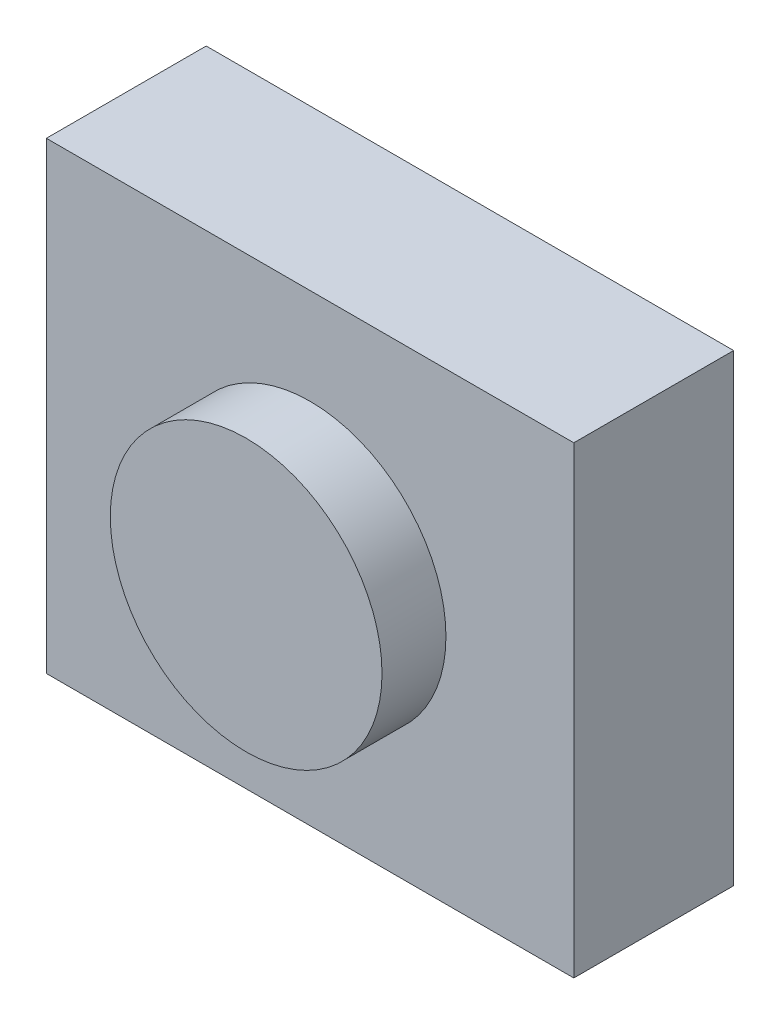
ISO-10303-21;
HEADER;
FILE_DESCRIPTION(('STEP AP214'),'2;1');
FILE_NAME('part.step','',(''),(''),'','','');
FILE_SCHEMA(('AUTOMOTIVE_DESIGN { 1 0 10303 214 1 1 1 1 }'));
ENDSEC;
DATA;
#1=APPLICATION_CONTEXT('core data for automotive mechanical design processes');
#2=APPLICATION_PROTOCOL_DEFINITION('international standard','automotive_design',2000,#1);
#3=PRODUCT_CONTEXT('',#1,'mechanical');
#4=PRODUCT('Part','Part','',(#3));
#5=PRODUCT_RELATED_PRODUCT_CATEGORY('part','',(#4));
#6=PRODUCT_DEFINITION_FORMATION('','',#4);
#7=PRODUCT_DEFINITION_CONTEXT('part definition',#1,'design');
#8=PRODUCT_DEFINITION('design','',#6,#7);
#9=PRODUCT_DEFINITION_SHAPE('','',#8);
#10=(LENGTH_UNIT() NAMED_UNIT(*) SI_UNIT(.MILLI.,.METRE.));
#11=(NAMED_UNIT(*) PLANE_ANGLE_UNIT() SI_UNIT($,.RADIAN.));
#12=(NAMED_UNIT(*) SI_UNIT($,.STERADIAN.) SOLID_ANGLE_UNIT());
#13=UNCERTAINTY_MEASURE_WITH_UNIT(LENGTH_MEASURE(1.E-05),#10,'distance_accuracy_value','');
#14=(GEOMETRIC_REPRESENTATION_CONTEXT(3) GLOBAL_UNCERTAINTY_ASSIGNED_CONTEXT((#13)) GLOBAL_UNIT_ASSIGNED_CONTEXT((#10,
#11,#12)) REPRESENTATION_CONTEXT('',''));
#15=CARTESIAN_POINT('',(0.,0.,0.));
#16=DIRECTION('',(0.,0.,1.));
#17=DIRECTION('',(1.,0.,0.));
#18=AXIS2_PLACEMENT_3D('',#15,#16,#17);
#19=CARTESIAN_POINT('',(0.,0.,1.4));
#20=DIRECTION('',(0.,0.,1.));
#21=DIRECTION('',(1.,0.,0.));
#22=AXIS2_PLACEMENT_3D('',#19,#20,#21);
#23=PLANE('',#22);
#24=CARTESIAN_POINT('',(0.,0.,1.4));
#25=DIRECTION('',(0.,0.,1.));
#26=DIRECTION('',(1.,0.,0.));
#27=AXIS2_PLACEMENT_3D('',#24,#25,#26);
#28=CIRCLE('',#27,0.85);
#29=CARTESIAN_POINT('',(0.85,0.,1.4));
#30=VERTEX_POINT('',#29);
#31=EDGE_CURVE('E20',#30,#30,#28,.F.);
#32=ORIENTED_EDGE('',*,*,#31,.F.);
#33=EDGE_LOOP('',(#32));
#34=FACE_BOUND('',#33,.T.);
#35=ADVANCED_FACE('F17',(#34),#23,.T.);
#36=CARTESIAN_POINT('',(0.,0.,1.));
#37=DIRECTION('',(0.,0.,1.));
#38=DIRECTION('',(1.,0.,0.));
#39=AXIS2_PLACEMENT_3D('',#36,#37,#38);
#40=CYLINDRICAL_SURFACE('',#39,0.85);
#41=CARTESIAN_POINT('',(0.,0.,1.));
#42=DIRECTION('',(0.,0.,1.));
#43=DIRECTION('',(1.,0.,0.));
#44=AXIS2_PLACEMENT_3D('',#41,#42,#43);
#45=CIRCLE('',#44,0.85);
#46=CARTESIAN_POINT('',(0.85,0.,1.));
#47=VERTEX_POINT('',#46);
#48=EDGE_CURVE('E75',#47,#47,#45,.F.);
#49=ORIENTED_EDGE('',*,*,#48,.F.);
#50=EDGE_LOOP('',(#49));
#51=FACE_BOUND('',#50,.T.);
#52=ORIENTED_EDGE('',*,*,#31,.T.);
#53=EDGE_LOOP('',(#52));
#54=FACE_BOUND('',#53,.T.);
#55=ADVANCED_FACE('F89',(#51,#54),#40,.T.);
#56=CARTESIAN_POINT('',(0.,0.,1.));
#57=DIRECTION('',(0.,0.,1.));
#58=DIRECTION('',(1.,0.,0.));
#59=AXIS2_PLACEMENT_3D('',#56,#57,#58);
#60=PLANE('',#59);
#61=ORIENTED_EDGE('',*,*,#48,.T.);
#62=EDGE_LOOP('',(#61));
#63=FACE_BOUND('',#62,.T.);
#64=DIRECTION('',(0.,1.,0.));
#65=VECTOR('',#64,1.);
#66=CARTESIAN_POINT('',(-1.65,1.45,1.));
#67=LINE('',#66,#65);
#68=CARTESIAN_POINT('',(-1.65,-1.45,1.));
#69=VERTEX_POINT('',#68);
#70=CARTESIAN_POINT('',(-1.65,1.45,1.));
#71=VERTEX_POINT('',#70);
#72=EDGE_CURVE('E58',#69,#71,#67,.T.);
#73=ORIENTED_EDGE('',*,*,#72,.F.);
#74=DIRECTION('',(1.,0.,0.));
#75=VECTOR('',#74,1.);
#76=CARTESIAN_POINT('',(-1.65,-1.45,1.));
#77=LINE('',#76,#75);
#78=CARTESIAN_POINT('',(1.65,-1.45,1.));
#79=VERTEX_POINT('',#78);
#80=EDGE_CURVE('E53',#79,#69,#77,.F.);
#81=ORIENTED_EDGE('',*,*,#80,.F.);
#82=DIRECTION('',(0.,1.,0.));
#83=VECTOR('',#82,1.);
#84=CARTESIAN_POINT('',(1.65,-1.45,1.));
#85=LINE('',#84,#83);
#86=CARTESIAN_POINT('',(1.65,1.45,1.));
#87=VERTEX_POINT('',#86);
#88=EDGE_CURVE('E71',#87,#79,#85,.F.);
#89=ORIENTED_EDGE('',*,*,#88,.F.);
#90=DIRECTION('',(1.,0.,0.));
#91=VECTOR('',#90,1.);
#92=CARTESIAN_POINT('',(1.65,1.45,1.));
#93=LINE('',#92,#91);
#94=EDGE_CURVE('E67',#71,#87,#93,.T.);
#95=ORIENTED_EDGE('',*,*,#94,.F.);
#96=EDGE_LOOP('',(#73,#81,#89,#95));
#97=FACE_BOUND('',#96,.T.);
#98=ADVANCED_FACE('F70',(#63,#97),#60,.T.);
#99=CARTESIAN_POINT('',(1.65,1.45,0.));
#100=DIRECTION('',(0.,1.,0.));
#101=DIRECTION('',(0.,0.,1.));
#102=AXIS2_PLACEMENT_3D('',#99,#100,#101);
#103=PLANE('',#102);
#104=ORIENTED_EDGE('',*,*,#94,.T.);
#105=DIRECTION('',(0.,0.,-1.));
#106=VECTOR('',#105,1.);
#107=CARTESIAN_POINT('',(1.65,1.45,0.));
#108=LINE('',#107,#106);
#109=CARTESIAN_POINT('',(1.65,1.45,0.));
#110=VERTEX_POINT('',#109);
#111=EDGE_CURVE('E216',#110,#87,#108,.F.);
#112=ORIENTED_EDGE('',*,*,#111,.F.);
#113=DIRECTION('',(1.,0.,0.));
#114=VECTOR('',#113,1.);
#115=CARTESIAN_POINT('',(0.,1.45,0.));
#116=LINE('',#115,#114);
#117=CARTESIAN_POINT('',(-1.65,1.45,0.));
#118=VERTEX_POINT('',#117);
#119=EDGE_CURVE('E79',#110,#118,#116,.F.);
#120=ORIENTED_EDGE('',*,*,#119,.T.);
#121=DIRECTION('',(0.,0.,1.));
#122=VECTOR('',#121,1.);
#123=CARTESIAN_POINT('',(-1.65,1.45,0.));
#124=LINE('',#123,#122);
#125=EDGE_CURVE('E63',#71,#118,#124,.F.);
#126=ORIENTED_EDGE('',*,*,#125,.F.);
#127=EDGE_LOOP('',(#104,#112,#120,#126));
#128=FACE_BOUND('',#127,.T.);
#129=ADVANCED_FACE('F78',(#128),#103,.T.);
#130=CARTESIAN_POINT('',(-1.65,1.45,0.));
#131=DIRECTION('',(-1.,0.,0.));
#132=DIRECTION('',(0.,0.,1.));
#133=AXIS2_PLACEMENT_3D('',#130,#131,#132);
#134=PLANE('',#133);
#135=ORIENTED_EDGE('',*,*,#72,.T.);
#136=ORIENTED_EDGE('',*,*,#125,.T.);
#137=DIRECTION('',(0.,1.,0.));
#138=VECTOR('',#137,1.);
#139=CARTESIAN_POINT('',(-1.65,0.,0.));
#140=LINE('',#139,#138);
#141=CARTESIAN_POINT('',(-1.65,-1.45,0.));
#142=VERTEX_POINT('',#141);
#143=EDGE_CURVE('E209',#118,#142,#140,.F.);
#144=ORIENTED_EDGE('',*,*,#143,.T.);
#145=DIRECTION('',(0.,0.,1.));
#146=VECTOR('',#145,1.);
#147=CARTESIAN_POINT('',(-1.65,-1.45,0.));
#148=LINE('',#147,#146);
#149=EDGE_CURVE('E65',#69,#142,#148,.F.);
#150=ORIENTED_EDGE('',*,*,#149,.F.);
#151=EDGE_LOOP('',(#135,#136,#144,#150));
#152=FACE_BOUND('',#151,.T.);
#153=ADVANCED_FACE('F60',(#152),#134,.T.);
#154=CARTESIAN_POINT('',(-1.65,-1.45,0.));
#155=DIRECTION('',(0.,-1.,0.));
#156=DIRECTION('',(1.,0.,0.));
#157=AXIS2_PLACEMENT_3D('',#154,#155,#156);
#158=PLANE('',#157);
#159=ORIENTED_EDGE('',*,*,#80,.T.);
#160=ORIENTED_EDGE('',*,*,#149,.T.);
#161=DIRECTION('',(1.,0.,0.));
#162=VECTOR('',#161,1.);
#163=CARTESIAN_POINT('',(0.,-1.45,0.));
#164=LINE('',#163,#162);
#165=CARTESIAN_POINT('',(1.65,-1.45,0.));
#166=VERTEX_POINT('',#165);
#167=EDGE_CURVE('E26',#142,#166,#164,.T.);
#168=ORIENTED_EDGE('',*,*,#167,.T.);
#169=DIRECTION('',(0.,0.,-1.));
#170=VECTOR('',#169,1.);
#171=CARTESIAN_POINT('',(1.65,-1.45,0.));
#172=LINE('',#171,#170);
#173=EDGE_CURVE('E34',#79,#166,#172,.T.);
#174=ORIENTED_EDGE('',*,*,#173,.F.);
#175=EDGE_LOOP('',(#159,#160,#168,#174));
#176=FACE_BOUND('',#175,.T.);
#177=ADVANCED_FACE('F105',(#176),#158,.T.);
#178=CARTESIAN_POINT('',(1.65,-1.45,0.));
#179=DIRECTION('',(1.,0.,0.));
#180=DIRECTION('',(0.,0.,-1.));
#181=AXIS2_PLACEMENT_3D('',#178,#179,#180);
#182=PLANE('',#181);
#183=ORIENTED_EDGE('',*,*,#88,.T.);
#184=ORIENTED_EDGE('',*,*,#173,.T.);
#185=DIRECTION('',(0.,1.,0.));
#186=VECTOR('',#185,1.);
#187=CARTESIAN_POINT('',(1.65,0.,0.));
#188=LINE('',#187,#186);
#189=EDGE_CURVE('E11',#166,#110,#188,.T.);
#190=ORIENTED_EDGE('',*,*,#189,.T.);
#191=ORIENTED_EDGE('',*,*,#111,.T.);
#192=EDGE_LOOP('',(#183,#184,#190,#191));
#193=FACE_BOUND('',#192,.T.);
#194=ADVANCED_FACE('F99',(#193),#182,.T.);
#195=CARTESIAN_POINT('',(0.,0.,0.));
#196=DIRECTION('',(0.,0.,1.));
#197=DIRECTION('',(1.,0.,0.));
#198=AXIS2_PLACEMENT_3D('',#195,#196,#197);
#199=PLANE('',#198);
#200=ORIENTED_EDGE('',*,*,#167,.F.);
#201=ORIENTED_EDGE('',*,*,#143,.F.);
#202=ORIENTED_EDGE('',*,*,#119,.F.);
#203=ORIENTED_EDGE('',*,*,#189,.F.);
#204=EDGE_LOOP('',(#200,#201,#202,#203));
#205=FACE_BOUND('',#204,.T.);
#206=ADVANCED_FACE('F97',(#205),#199,.F.);
#207=CLOSED_SHELL('',(#35,#55,#98,#129,#153,#177,#194,#206));
#208=MANIFOLD_SOLID_BREP('B1',#207);
#209=ADVANCED_BREP_SHAPE_REPRESENTATION('',(#18,#208),#14);
#210=SHAPE_DEFINITION_REPRESENTATION(#9,#209);
ENDSEC;
END-ISO-10303-21;
